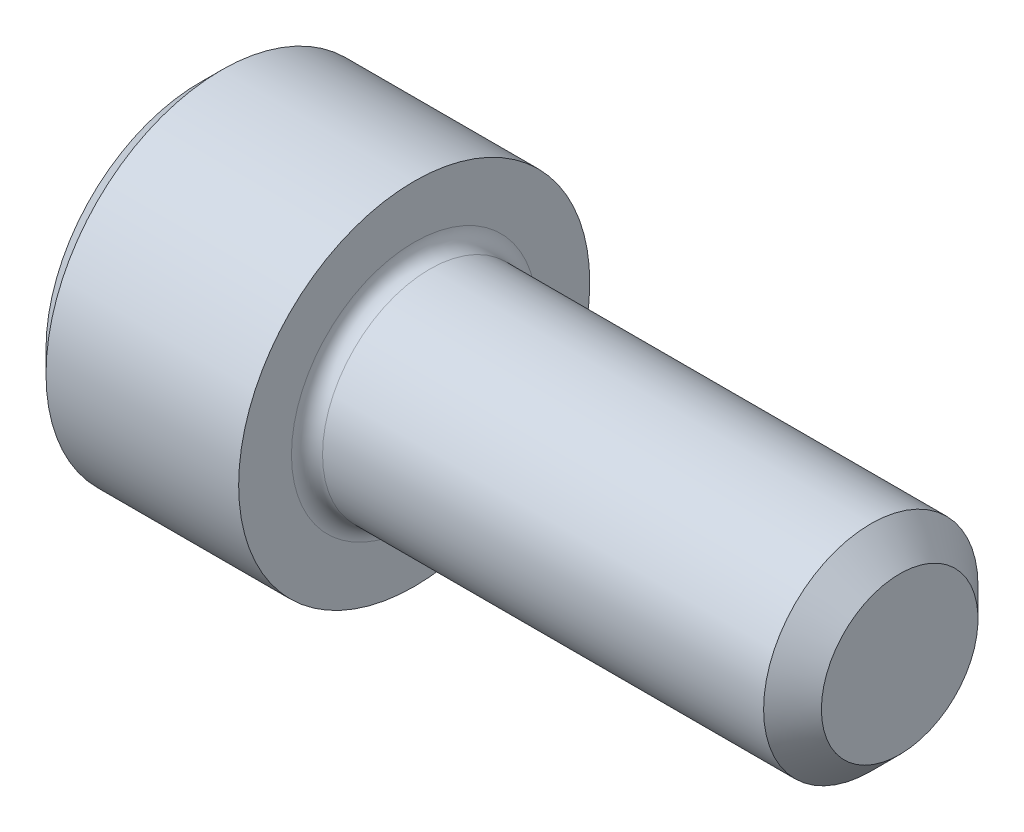
ISO-10303-21;
HEADER;
FILE_DESCRIPTION(('STEP AP214'),'2;1');
FILE_NAME('part.step','',(''),(''),'','','');
FILE_SCHEMA(('AUTOMOTIVE_DESIGN { 1 0 10303 214 1 1 1 1 }'));
ENDSEC;
DATA;
#1=APPLICATION_CONTEXT('core data for automotive mechanical design processes');
#2=APPLICATION_PROTOCOL_DEFINITION('international standard','automotive_design',2000,#1);
#3=PRODUCT_CONTEXT('',#1,'mechanical');
#4=PRODUCT('Part','Part','',(#3));
#5=PRODUCT_RELATED_PRODUCT_CATEGORY('part','',(#4));
#6=PRODUCT_DEFINITION_FORMATION('','',#4);
#7=PRODUCT_DEFINITION_CONTEXT('part definition',#1,'design');
#8=PRODUCT_DEFINITION('design','',#6,#7);
#9=PRODUCT_DEFINITION_SHAPE('','',#8);
#10=(LENGTH_UNIT() NAMED_UNIT(*) SI_UNIT(.MILLI.,.METRE.));
#11=(NAMED_UNIT(*) PLANE_ANGLE_UNIT() SI_UNIT($,.RADIAN.));
#12=(NAMED_UNIT(*) SI_UNIT($,.STERADIAN.) SOLID_ANGLE_UNIT());
#13=UNCERTAINTY_MEASURE_WITH_UNIT(LENGTH_MEASURE(1.E-05),#10,'distance_accuracy_value','');
#14=(GEOMETRIC_REPRESENTATION_CONTEXT(3) GLOBAL_UNCERTAINTY_ASSIGNED_CONTEXT((#13)) GLOBAL_UNIT_ASSIGNED_CONTEXT((#10,
#11,#12)) REPRESENTATION_CONTEXT('',''));
#15=CARTESIAN_POINT('',(0.,0.,0.));
#16=DIRECTION('',(0.,0.,1.));
#17=DIRECTION('',(1.,0.,0.));
#18=AXIS2_PLACEMENT_3D('',#15,#16,#17);
#19=CARTESIAN_POINT('',(0.,0.,0.));
#20=DIRECTION('',(-1.,0.,0.));
#21=DIRECTION('',(0.,0.,1.));
#22=AXIS2_PLACEMENT_3D('',#19,#20,#21);
#23=PLANE('',#22);
#24=DIRECTION('',(0.,-0.499999999999999,0.866025403784439));
#25=VECTOR('',#24,1.);
#26=CARTESIAN_POINT('',(0.,1.5984519552784,0.));
#27=LINE('',#26,#25);
#28=CARTESIAN_POINT('',(0.,1.5984519552784,0.));
#29=VERTEX_POINT('',#28);
#30=CARTESIAN_POINT('',(0.,0.799225977639205,1.3843));
#31=VERTEX_POINT('',#30);
#32=EDGE_CURVE('E261',#29,#31,#27,.T.);
#33=ORIENTED_EDGE('',*,*,#32,.T.);
#34=DIRECTION('',(0.,1.,0.));
#35=VECTOR('',#34,1.);
#36=CARTESIAN_POINT('',(0.,-0.799225977639191,1.3843));
#37=LINE('',#36,#35);
#38=CARTESIAN_POINT('',(0.,-0.799225977639191,1.3843));
#39=VERTEX_POINT('',#38);
#40=EDGE_CURVE('E132',#39,#31,#37,.T.);
#41=ORIENTED_EDGE('',*,*,#40,.F.);
#42=DIRECTION('',(0.,-0.500000000000001,-0.866025403784438));
#43=VECTOR('',#42,1.);
#44=CARTESIAN_POINT('',(0.,-0.799225977639191,1.3843));
#45=LINE('',#44,#43);
#46=CARTESIAN_POINT('',(0.,-1.59845195527839,0.));
#47=VERTEX_POINT('',#46);
#48=EDGE_CURVE('E264',#39,#47,#45,.T.);
#49=ORIENTED_EDGE('',*,*,#48,.T.);
#50=DIRECTION('',(0.,0.499999999999999,-0.86602540378444));
#51=VECTOR('',#50,1.);
#52=CARTESIAN_POINT('',(0.,-1.59845195527839,0.));
#53=LINE('',#52,#51);
#54=CARTESIAN_POINT('',(0.,-0.799225977639196,-1.3843));
#55=VERTEX_POINT('',#54);
#56=EDGE_CURVE('E267',#47,#55,#53,.T.);
#57=ORIENTED_EDGE('',*,*,#56,.T.);
#58=DIRECTION('',(0.,-1.,0.));
#59=VECTOR('',#58,1.);
#60=CARTESIAN_POINT('',(0.,0.799225977639202,-1.3843));
#61=LINE('',#60,#59);
#62=CARTESIAN_POINT('',(0.,0.799225977639202,-1.3843));
#63=VERTEX_POINT('',#62);
#64=EDGE_CURVE('E270',#63,#55,#61,.T.);
#65=ORIENTED_EDGE('',*,*,#64,.F.);
#66=DIRECTION('',(0.,-0.500000000000001,-0.866025403784438));
#67=VECTOR('',#66,1.);
#68=CARTESIAN_POINT('',(0.,1.5984519552784,0.));
#69=LINE('',#68,#67);
#70=EDGE_CURVE('E127',#29,#63,#69,.T.);
#71=ORIENTED_EDGE('',*,*,#70,.F.);
#72=EDGE_LOOP('',(#33,#41,#49,#57,#65,#71));
#73=FACE_BOUND('',#72,.T.);
#74=CARTESIAN_POINT('',(0.,0.,0.));
#75=DIRECTION('',(-1.,0.,0.));
#76=DIRECTION('',(0.,0.,1.));
#77=AXIS2_PLACEMENT_3D('',#74,#75,#76);
#78=CIRCLE('',#77,2.51460000000001);
#79=CARTESIAN_POINT('',(0.,0.,2.51460000000001));
#80=VERTEX_POINT('',#79);
#81=EDGE_CURVE('E156',#80,#80,#78,.T.);
#82=ORIENTED_EDGE('',*,*,#81,.T.);
#83=EDGE_LOOP('',(#82));
#84=FACE_BOUND('',#83,.T.);
#85=ADVANCED_FACE('F36',(#73,#84),#23,.T.);
#86=CARTESIAN_POINT('',(0.,0.,0.));
#87=DIRECTION('',(1.,0.,0.));
#88=DIRECTION('',(0.,0.,-1.));
#89=AXIS2_PLACEMENT_3D('',#86,#87,#88);
#90=CONICAL_SURFACE('',#89,2.51460000000001,0.785398163397436);
#91=CARTESIAN_POINT('',(0.355600000000005,0.,0.));
#92=DIRECTION('',(-1.,0.,0.));
#93=DIRECTION('',(0.,0.,1.));
#94=AXIS2_PLACEMENT_3D('',#91,#92,#93);
#95=CIRCLE('',#94,2.8702);
#96=CARTESIAN_POINT('',(0.355600000000005,0.,2.8702));
#97=VERTEX_POINT('',#96);
#98=EDGE_CURVE('E153',#97,#97,#95,.T.);
#99=ORIENTED_EDGE('',*,*,#98,.T.);
#100=EDGE_LOOP('',(#99));
#101=FACE_BOUND('',#100,.T.);
#102=ORIENTED_EDGE('',*,*,#81,.F.);
#103=EDGE_LOOP('',(#102));
#104=FACE_BOUND('',#103,.T.);
#105=ADVANCED_FACE('F177',(#101,#104),#90,.T.);
#106=CARTESIAN_POINT('',(-31.75,0.,0.));
#107=DIRECTION('',(-1.,0.,0.));
#108=DIRECTION('',(0.,0.,1.));
#109=AXIS2_PLACEMENT_3D('',#106,#107,#108);
#110=CYLINDRICAL_SURFACE('',#109,2.8702);
#111=CARTESIAN_POINT('',(3.5052,0.,0.));
#112=DIRECTION('',(-1.,0.,0.));
#113=DIRECTION('',(0.,0.,1.));
#114=AXIS2_PLACEMENT_3D('',#111,#112,#113);
#115=CIRCLE('',#114,2.8702);
#116=CARTESIAN_POINT('',(3.5052,0.,2.8702));
#117=VERTEX_POINT('',#116);
#118=EDGE_CURVE('E150',#117,#117,#115,.T.);
#119=ORIENTED_EDGE('',*,*,#118,.T.);
#120=EDGE_LOOP('',(#119));
#121=FACE_BOUND('',#120,.T.);
#122=ORIENTED_EDGE('',*,*,#98,.F.);
#123=EDGE_LOOP('',(#122));
#124=FACE_BOUND('',#123,.T.);
#125=ADVANCED_FACE('F182',(#121,#124),#110,.T.);
#126=CARTESIAN_POINT('',(3.5052,2.8702,0.));
#127=DIRECTION('',(1.,0.,0.));
#128=DIRECTION('',(0.,0.,-1.));
#129=AXIS2_PLACEMENT_3D('',#126,#127,#128);
#130=PLANE('',#129);
#131=CARTESIAN_POINT('',(3.5052,0.,0.));
#132=DIRECTION('',(1.,0.,0.));
#133=DIRECTION('',(0.,0.,-1.));
#134=AXIS2_PLACEMENT_3D('',#131,#132,#133);
#135=CIRCLE('',#134,2.0066);
#136=CARTESIAN_POINT('',(3.5052,0.,-2.0066));
#137=VERTEX_POINT('',#136);
#138=EDGE_CURVE('E44',#137,#137,#135,.F.);
#139=ORIENTED_EDGE('',*,*,#138,.T.);
#140=EDGE_LOOP('',(#139));
#141=FACE_BOUND('',#140,.T.);
#142=ORIENTED_EDGE('',*,*,#118,.F.);
#143=EDGE_LOOP('',(#142));
#144=FACE_BOUND('',#143,.T.);
#145=ADVANCED_FACE('F161',(#141,#144),#130,.T.);
#146=CARTESIAN_POINT('',(-31.75,0.,0.));
#147=DIRECTION('',(-1.,0.,0.));
#148=DIRECTION('',(0.,0.,1.));
#149=AXIS2_PLACEMENT_3D('',#146,#147,#148);
#150=CYLINDRICAL_SURFACE('',#149,1.7526);
#151=CARTESIAN_POINT('',(3.7592,0.,0.));
#152=DIRECTION('',(1.,0.,0.));
#153=DIRECTION('',(0.,0.,-1.));
#154=AXIS2_PLACEMENT_3D('',#151,#152,#153);
#155=CIRCLE('',#154,1.7526);
#156=CARTESIAN_POINT('',(3.7592,0.,-1.7526));
#157=VERTEX_POINT('',#156);
#158=EDGE_CURVE('E11',#157,#157,#155,.T.);
#159=ORIENTED_EDGE('',*,*,#158,.T.);
#160=EDGE_LOOP('',(#159));
#161=FACE_BOUND('',#160,.T.);
#162=CARTESIAN_POINT('',(10.97026,0.,0.));
#163=DIRECTION('',(-1.,0.,0.));
#164=DIRECTION('',(0.,0.,1.));
#165=AXIS2_PLACEMENT_3D('',#162,#163,#164);
#166=CIRCLE('',#165,1.7526);
#167=CARTESIAN_POINT('',(10.97026,0.,1.7526));
#168=VERTEX_POINT('',#167);
#169=EDGE_CURVE('E147',#168,#168,#166,.T.);
#170=ORIENTED_EDGE('',*,*,#169,.T.);
#171=EDGE_LOOP('',(#170));
#172=FACE_BOUND('',#171,.T.);
#173=ADVANCED_FACE('F192',(#161,#172),#150,.T.);
#174=CARTESIAN_POINT('',(11.4427,0.,0.));
#175=DIRECTION('',(-1.,0.,0.));
#176=DIRECTION('',(0.,0.,1.));
#177=AXIS2_PLACEMENT_3D('',#174,#175,#176);
#178=CONICAL_SURFACE('',#177,1.28016,0.785398163397457);
#179=ORIENTED_EDGE('',*,*,#169,.F.);
#180=EDGE_LOOP('',(#179));
#181=FACE_BOUND('',#180,.T.);
#182=CARTESIAN_POINT('',(11.4427,0.,0.));
#183=DIRECTION('',(-1.,0.,0.));
#184=DIRECTION('',(0.,0.,1.));
#185=AXIS2_PLACEMENT_3D('',#182,#183,#184);
#186=CIRCLE('',#185,1.28016);
#187=CARTESIAN_POINT('',(11.4427,0.,1.28016));
#188=VERTEX_POINT('',#187);
#189=EDGE_CURVE('E143',#188,#188,#186,.T.);
#190=ORIENTED_EDGE('',*,*,#189,.T.);
#191=EDGE_LOOP('',(#190));
#192=FACE_BOUND('',#191,.T.);
#193=ADVANCED_FACE('F172',(#181,#192),#178,.T.);
#194=CARTESIAN_POINT('',(11.4427,1.28016,0.));
#195=DIRECTION('',(1.,0.,0.));
#196=DIRECTION('',(0.,0.,-1.));
#197=AXIS2_PLACEMENT_3D('',#194,#195,#196);
#198=PLANE('',#197);
#199=ORIENTED_EDGE('',*,*,#189,.F.);
#200=EDGE_LOOP('',(#199));
#201=FACE_BOUND('',#200,.T.);
#202=ADVANCED_FACE('F165',(#201),#198,.T.);
#203=CARTESIAN_POINT('',(3.7592,0.,0.));
#204=DIRECTION('',(1.,0.,0.));
#205=DIRECTION('',(0.,0.,-1.));
#206=AXIS2_PLACEMENT_3D('',#203,#204,#205);
#207=TOROIDAL_SURFACE('',#206,2.0066,0.254);
#208=ORIENTED_EDGE('',*,*,#158,.F.);
#209=EDGE_LOOP('',(#208));
#210=FACE_BOUND('',#209,.T.);
#211=ORIENTED_EDGE('',*,*,#138,.F.);
#212=EDGE_LOOP('',(#211));
#213=FACE_BOUND('',#212,.T.);
#214=ADVANCED_FACE('F38',(#210,#213),#207,.F.);
#215=CARTESIAN_POINT('',(1.6256,1.5984519552784,0.));
#216=DIRECTION('',(0.,-0.866025403784439,-0.499999999999999));
#217=DIRECTION('',(0.,0.499999999999999,-0.866025403784439));
#218=AXIS2_PLACEMENT_3D('',#215,#216,#217);
#219=PLANE('',#218);
#220=ORIENTED_EDGE('',*,*,#32,.F.);
#221=DIRECTION('',(-1.,0.,0.));
#222=VECTOR('',#221,1.);
#223=CARTESIAN_POINT('',(1.6256,1.5984519552784,0.));
#224=LINE('',#223,#222);
#225=CARTESIAN_POINT('',(1.6256,1.5984519552784,0.));
#226=VERTEX_POINT('',#225);
#227=EDGE_CURVE('E251',#226,#29,#224,.T.);
#228=ORIENTED_EDGE('',*,*,#227,.F.);
#229=DIRECTION('',(0.,-0.499999999999999,0.866025403784439));
#230=VECTOR('',#229,1.);
#231=CARTESIAN_POINT('',(1.6256,1.5984519552784,0.));
#232=LINE('',#231,#230);
#233=CARTESIAN_POINT('',(1.6256,1.1988389664588,0.692150000000001));
#234=VERTEX_POINT('',#233);
#235=EDGE_CURVE('E119',#226,#234,#232,.T.);
#236=ORIENTED_EDGE('',*,*,#235,.T.);
#237=CARTESIAN_POINT('',(1.6256,0.799225977639205,1.3843));
#238=VERTEX_POINT('',#237);
#239=EDGE_CURVE('E110',#234,#238,#232,.T.);
#240=ORIENTED_EDGE('',*,*,#239,.T.);
#241=DIRECTION('',(-1.,0.,0.));
#242=VECTOR('',#241,1.);
#243=CARTESIAN_POINT('',(1.6256,0.799225977639205,1.3843));
#244=LINE('',#243,#242);
#245=EDGE_CURVE('E124',#238,#31,#244,.T.);
#246=ORIENTED_EDGE('',*,*,#245,.T.);
#247=EDGE_LOOP('',(#220,#228,#236,#240,#246));
#248=FACE_BOUND('',#247,.T.);
#249=ADVANCED_FACE('F123',(#248),#219,.T.);
#250=CARTESIAN_POINT('',(1.6256,-0.799225977639191,1.3843));
#251=DIRECTION('',(0.,0.,1.));
#252=DIRECTION('',(0.,-1.,0.));
#253=AXIS2_PLACEMENT_3D('',#250,#251,#252);
#254=PLANE('',#253);
#255=ORIENTED_EDGE('',*,*,#40,.T.);
#256=ORIENTED_EDGE('',*,*,#245,.F.);
#257=DIRECTION('',(0.,1.,0.));
#258=VECTOR('',#257,1.);
#259=CARTESIAN_POINT('',(1.6256,-0.799225977639191,1.3843));
#260=LINE('',#259,#258);
#261=CARTESIAN_POINT('',(1.6256,0.,1.3843));
#262=VERTEX_POINT('',#261);
#263=EDGE_CURVE('E107',#262,#238,#260,.T.);
#264=ORIENTED_EDGE('',*,*,#263,.F.);
#265=CARTESIAN_POINT('',(1.6256,-0.799225977639191,1.3843));
#266=VERTEX_POINT('',#265);
#267=EDGE_CURVE('E118',#266,#262,#260,.T.);
#268=ORIENTED_EDGE('',*,*,#267,.F.);
#269=DIRECTION('',(-1.,0.,0.));
#270=VECTOR('',#269,1.);
#271=CARTESIAN_POINT('',(1.6256,-0.799225977639191,1.3843));
#272=LINE('',#271,#270);
#273=EDGE_CURVE('E134',#266,#39,#272,.T.);
#274=ORIENTED_EDGE('',*,*,#273,.T.);
#275=EDGE_LOOP('',(#255,#256,#264,#268,#274));
#276=FACE_BOUND('',#275,.T.);
#277=ADVANCED_FACE('F129',(#276),#254,.F.);
#278=CARTESIAN_POINT('',(1.6256,-0.799225977639191,1.3843));
#279=DIRECTION('',(0.,0.866025403784438,-0.500000000000001));
#280=DIRECTION('',(0.,0.500000000000001,0.866025403784438));
#281=AXIS2_PLACEMENT_3D('',#278,#279,#280);
#282=PLANE('',#281);
#283=ORIENTED_EDGE('',*,*,#48,.F.);
#284=ORIENTED_EDGE('',*,*,#273,.F.);
#285=DIRECTION('',(0.,-0.500000000000001,-0.866025403784438));
#286=VECTOR('',#285,1.);
#287=CARTESIAN_POINT('',(1.6256,-0.799225977639191,1.3843));
#288=LINE('',#287,#286);
#289=CARTESIAN_POINT('',(1.6256,-1.19883896645879,0.692149999999999));
#290=VERTEX_POINT('',#289);
#291=EDGE_CURVE('E290',#266,#290,#288,.T.);
#292=ORIENTED_EDGE('',*,*,#291,.T.);
#293=CARTESIAN_POINT('',(1.6256,-1.59845195527839,0.));
#294=VERTEX_POINT('',#293);
#295=EDGE_CURVE('E279',#290,#294,#288,.T.);
#296=ORIENTED_EDGE('',*,*,#295,.T.);
#297=DIRECTION('',(-1.,0.,0.));
#298=VECTOR('',#297,1.);
#299=CARTESIAN_POINT('',(1.6256,-1.59845195527839,0.));
#300=LINE('',#299,#298);
#301=EDGE_CURVE('E139',#294,#47,#300,.T.);
#302=ORIENTED_EDGE('',*,*,#301,.T.);
#303=EDGE_LOOP('',(#283,#284,#292,#296,#302));
#304=FACE_BOUND('',#303,.T.);
#305=ADVANCED_FACE('F205',(#304),#282,.T.);
#306=CARTESIAN_POINT('',(1.6256,-1.59845195527839,0.));
#307=DIRECTION('',(0.,0.866025403784439,0.499999999999999));
#308=DIRECTION('',(0.,-0.499999999999999,0.866025403784439));
#309=AXIS2_PLACEMENT_3D('',#306,#307,#308);
#310=PLANE('',#309);
#311=ORIENTED_EDGE('',*,*,#56,.F.);
#312=ORIENTED_EDGE('',*,*,#301,.F.);
#313=DIRECTION('',(0.,0.499999999999999,-0.86602540378444));
#314=VECTOR('',#313,1.);
#315=CARTESIAN_POINT('',(1.6256,-1.59845195527839,0.));
#316=LINE('',#315,#314);
#317=CARTESIAN_POINT('',(1.6256,-1.1988389664588,-0.692149999999996));
#318=VERTEX_POINT('',#317);
#319=EDGE_CURVE('E257',#294,#318,#316,.T.);
#320=ORIENTED_EDGE('',*,*,#319,.T.);
#321=CARTESIAN_POINT('',(1.6256,-0.799225977639196,-1.3843));
#322=VERTEX_POINT('',#321);
#323=EDGE_CURVE('E289',#318,#322,#316,.T.);
#324=ORIENTED_EDGE('',*,*,#323,.T.);
#325=DIRECTION('',(-1.,0.,0.));
#326=VECTOR('',#325,1.);
#327=CARTESIAN_POINT('',(1.6256,-0.799225977639196,-1.3843));
#328=LINE('',#327,#326);
#329=EDGE_CURVE('E250',#322,#55,#328,.T.);
#330=ORIENTED_EDGE('',*,*,#329,.T.);
#331=EDGE_LOOP('',(#311,#312,#320,#324,#330));
#332=FACE_BOUND('',#331,.T.);
#333=ADVANCED_FACE('F208',(#332),#310,.T.);
#334=CARTESIAN_POINT('',(1.6256,0.799225977639202,-1.3843));
#335=DIRECTION('',(0.,0.,-1.));
#336=DIRECTION('',(0.,1.,0.));
#337=AXIS2_PLACEMENT_3D('',#334,#335,#336);
#338=PLANE('',#337);
#339=ORIENTED_EDGE('',*,*,#64,.T.);
#340=ORIENTED_EDGE('',*,*,#329,.F.);
#341=DIRECTION('',(0.,-1.,0.));
#342=VECTOR('',#341,1.);
#343=CARTESIAN_POINT('',(1.6256,0.799225977639202,-1.3843));
#344=LINE('',#343,#342);
#345=CARTESIAN_POINT('',(1.6256,0.,-1.3843));
#346=VERTEX_POINT('',#345);
#347=EDGE_CURVE('E254',#346,#322,#344,.T.);
#348=ORIENTED_EDGE('',*,*,#347,.F.);
#349=CARTESIAN_POINT('',(1.6256,0.799225977639202,-1.3843));
#350=VERTEX_POINT('',#349);
#351=EDGE_CURVE('E51',#350,#346,#344,.T.);
#352=ORIENTED_EDGE('',*,*,#351,.F.);
#353=DIRECTION('',(-1.,0.,0.));
#354=VECTOR('',#353,1.);
#355=CARTESIAN_POINT('',(1.6256,0.799225977639202,-1.3843));
#356=LINE('',#355,#354);
#357=EDGE_CURVE('E247',#350,#63,#356,.T.);
#358=ORIENTED_EDGE('',*,*,#357,.T.);
#359=EDGE_LOOP('',(#339,#340,#348,#352,#358));
#360=FACE_BOUND('',#359,.T.);
#361=ADVANCED_FACE('F212',(#360),#338,.F.);
#362=CARTESIAN_POINT('',(1.6256,1.5984519552784,0.));
#363=DIRECTION('',(0.,0.866025403784438,-0.500000000000001));
#364=DIRECTION('',(0.,0.500000000000001,0.866025403784438));
#365=AXIS2_PLACEMENT_3D('',#362,#363,#364);
#366=PLANE('',#365);
#367=ORIENTED_EDGE('',*,*,#70,.T.);
#368=ORIENTED_EDGE('',*,*,#357,.F.);
#369=DIRECTION('',(0.,-0.500000000000001,-0.866025403784438));
#370=VECTOR('',#369,1.);
#371=CARTESIAN_POINT('',(1.6256,1.5984519552784,0.));
#372=LINE('',#371,#370);
#373=CARTESIAN_POINT('',(1.6256,1.1988389664588,-0.692150000000004));
#374=VERTEX_POINT('',#373);
#375=EDGE_CURVE('E237',#374,#350,#372,.T.);
#376=ORIENTED_EDGE('',*,*,#375,.F.);
#377=EDGE_CURVE('E243',#226,#374,#372,.T.);
#378=ORIENTED_EDGE('',*,*,#377,.F.);
#379=ORIENTED_EDGE('',*,*,#227,.T.);
#380=EDGE_LOOP('',(#367,#368,#376,#378,#379));
#381=FACE_BOUND('',#380,.T.);
#382=ADVANCED_FACE('F216',(#381),#366,.F.);
#383=CARTESIAN_POINT('',(1.6256,0.,2.7686));
#384=DIRECTION('',(1.,0.,0.));
#385=DIRECTION('',(0.,0.,-1.));
#386=AXIS2_PLACEMENT_3D('',#383,#384,#385);
#387=PLANE('',#386);
#388=ORIENTED_EDGE('',*,*,#347,.T.);
#389=ORIENTED_EDGE('',*,*,#323,.F.);
#390=CARTESIAN_POINT('',(1.6256,0.,0.));
#391=DIRECTION('',(-1.,0.,0.));
#392=DIRECTION('',(0.,0.,1.));
#393=AXIS2_PLACEMENT_3D('',#390,#391,#392);
#394=CIRCLE('',#393,1.3843);
#395=EDGE_CURVE('E285',#346,#318,#394,.T.);
#396=ORIENTED_EDGE('',*,*,#395,.F.);
#397=EDGE_LOOP('',(#388,#389,#396));
#398=FACE_BOUND('',#397,.T.);
#399=ADVANCED_FACE('F220',(#398),#387,.F.);
#400=ORIENTED_EDGE('',*,*,#319,.F.);
#401=ORIENTED_EDGE('',*,*,#295,.F.);
#402=EDGE_CURVE('E137',#318,#290,#394,.T.);
#403=ORIENTED_EDGE('',*,*,#402,.F.);
#404=EDGE_LOOP('',(#400,#401,#403));
#405=FACE_BOUND('',#404,.T.);
#406=ADVANCED_FACE('F223',(#405),#387,.F.);
#407=ORIENTED_EDGE('',*,*,#291,.F.);
#408=ORIENTED_EDGE('',*,*,#267,.T.);
#409=EDGE_CURVE('E133',#290,#262,#394,.T.);
#410=ORIENTED_EDGE('',*,*,#409,.F.);
#411=EDGE_LOOP('',(#407,#408,#410));
#412=FACE_BOUND('',#411,.T.);
#413=ADVANCED_FACE('F228',(#412),#387,.F.);
#414=ORIENTED_EDGE('',*,*,#263,.T.);
#415=ORIENTED_EDGE('',*,*,#239,.F.);
#416=EDGE_CURVE('E113',#262,#234,#394,.T.);
#417=ORIENTED_EDGE('',*,*,#416,.F.);
#418=EDGE_LOOP('',(#414,#415,#417));
#419=FACE_BOUND('',#418,.T.);
#420=ADVANCED_FACE('F109',(#419),#387,.F.);
#421=ORIENTED_EDGE('',*,*,#235,.F.);
#422=ORIENTED_EDGE('',*,*,#377,.T.);
#423=EDGE_CURVE('E144',#234,#374,#394,.T.);
#424=ORIENTED_EDGE('',*,*,#423,.F.);
#425=EDGE_LOOP('',(#421,#422,#424));
#426=FACE_BOUND('',#425,.T.);
#427=ADVANCED_FACE('F231',(#426),#387,.F.);
#428=ORIENTED_EDGE('',*,*,#375,.T.);
#429=ORIENTED_EDGE('',*,*,#351,.T.);
#430=EDGE_CURVE('E240',#374,#346,#394,.T.);
#431=ORIENTED_EDGE('',*,*,#430,.F.);
#432=EDGE_LOOP('',(#428,#429,#431));
#433=FACE_BOUND('',#432,.T.);
#434=ADVANCED_FACE('F201',(#433),#387,.F.);
#435=CARTESIAN_POINT('',(1.6256,0.,0.));
#436=DIRECTION('',(-1.,0.,0.));
#437=DIRECTION('',(0.,0.,1.));
#438=AXIS2_PLACEMENT_3D('',#435,#436,#437);
#439=CONICAL_SURFACE('',#438,1.3843,1.04719755119659);
#440=CARTESIAN_POINT('',(2.4248259776392,0.,0.));
#441=VERTEX_POINT('',#440);
#442=VERTEX_LOOP('',#441);
#443=FACE_BOUND('',#442,.T.);
#444=ORIENTED_EDGE('',*,*,#416,.T.);
#445=ORIENTED_EDGE('',*,*,#423,.T.);
#446=ORIENTED_EDGE('',*,*,#430,.T.);
#447=ORIENTED_EDGE('',*,*,#395,.T.);
#448=ORIENTED_EDGE('',*,*,#402,.T.);
#449=ORIENTED_EDGE('',*,*,#409,.T.);
#450=EDGE_LOOP('',(#444,#445,#446,#447,#448,#449));
#451=FACE_BOUND('',#450,.T.);
#452=ADVANCED_FACE('F199',(#443,#451),#439,.F.);
#453=CLOSED_SHELL('',(#85,#105,#125,#145,#173,#193,#202,#214,#249,#277,#305,#333,#361,#382,#399,
#406,#413,#420,#427,#434,#452));
#454=MANIFOLD_SOLID_BREP('B2',#453);
#455=ADVANCED_BREP_SHAPE_REPRESENTATION('',(#18,#454),#14);
#456=SHAPE_DEFINITION_REPRESENTATION(#9,#455);
ENDSEC;
END-ISO-10303-21;
